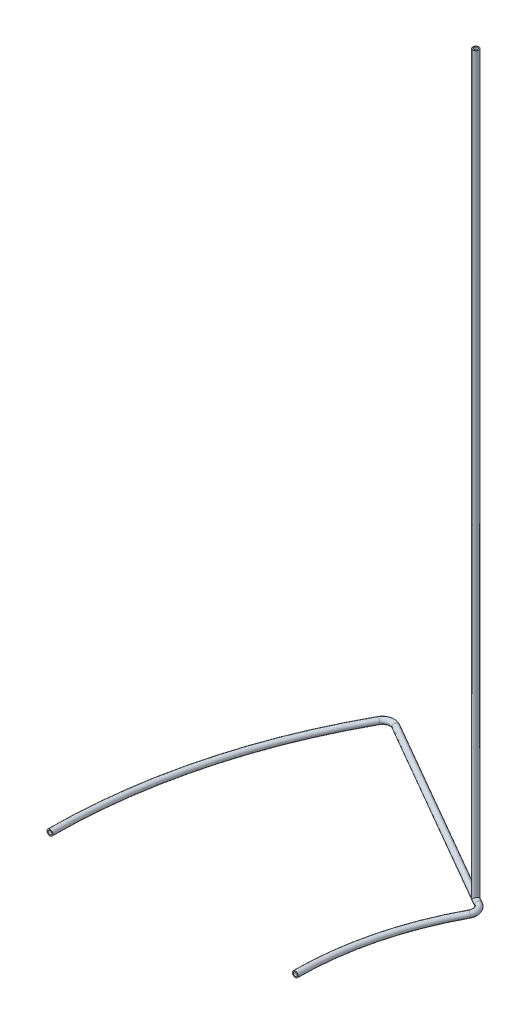
ISO-10303-21;
HEADER;
FILE_DESCRIPTION(('STEP AP214'),'2;1');
FILE_NAME('part.step','',(''),(''),'','','');
FILE_SCHEMA(('AUTOMOTIVE_DESIGN { 1 0 10303 214 1 1 1 1 }'));
ENDSEC;
DATA;
#1=APPLICATION_CONTEXT('core data for automotive mechanical design processes');
#2=APPLICATION_PROTOCOL_DEFINITION('international standard','automotive_design',2000,#1);
#3=PRODUCT_CONTEXT('',#1,'mechanical');
#4=PRODUCT('Part','Part','',(#3));
#5=PRODUCT_RELATED_PRODUCT_CATEGORY('part','',(#4));
#6=PRODUCT_DEFINITION_FORMATION('','',#4);
#7=PRODUCT_DEFINITION_CONTEXT('part definition',#1,'design');
#8=PRODUCT_DEFINITION('design','',#6,#7);
#9=PRODUCT_DEFINITION_SHAPE('','',#8);
#10=(LENGTH_UNIT() NAMED_UNIT(*) SI_UNIT(.MILLI.,.METRE.));
#11=(NAMED_UNIT(*) PLANE_ANGLE_UNIT() SI_UNIT($,.RADIAN.));
#12=(NAMED_UNIT(*) SI_UNIT($,.STERADIAN.) SOLID_ANGLE_UNIT());
#13=UNCERTAINTY_MEASURE_WITH_UNIT(LENGTH_MEASURE(1.E-05),#10,'distance_accuracy_value','');
#14=(GEOMETRIC_REPRESENTATION_CONTEXT(3) GLOBAL_UNCERTAINTY_ASSIGNED_CONTEXT((#13)) GLOBAL_UNIT_ASSIGNED_CONTEXT((#10,
#11,#12)) REPRESENTATION_CONTEXT('',''));
#15=CARTESIAN_POINT('',(0.,0.,0.));
#16=DIRECTION('',(0.,0.,1.));
#17=DIRECTION('',(1.,0.,0.));
#18=AXIS2_PLACEMENT_3D('',#15,#16,#17);
#19=CARTESIAN_POINT('',(-600.,0.,-2.98554080839911E-13));
#20=DIRECTION('',(0.,0.,-1.));
#21=DIRECTION('',(-1.,0.,0.));
#22=AXIS2_PLACEMENT_3D('',#19,#20,#21);
#23=PLANE('',#22);
#24=CARTESIAN_POINT('',(-600.,0.,0.));
#25=DIRECTION('',(0.,0.,-1.));
#26=DIRECTION('',(-1.,0.,0.));
#27=AXIS2_PLACEMENT_3D('',#24,#25,#26);
#28=CIRCLE('',#27,4.0000000000001);
#29=CARTESIAN_POINT('',(-604.,0.,0.));
#30=VERTEX_POINT('',#29);
#31=EDGE_CURVE('E93',#30,#30,#28,.T.);
#32=ORIENTED_EDGE('',*,*,#31,.T.);
#33=EDGE_LOOP('',(#32));
#34=FACE_BOUND('',#33,.T.);
#35=CARTESIAN_POINT('',(-600.,0.,-2.98554080839911E-13));
#36=DIRECTION('',(0.,0.,-1.));
#37=DIRECTION('',(-1.,0.,0.));
#38=AXIS2_PLACEMENT_3D('',#35,#36,#37);
#39=CIRCLE('',#38,6.0000000000001);
#40=CARTESIAN_POINT('',(-606.,0.,-3.01539621648311E-13));
#41=VERTEX_POINT('',#40);
#42=EDGE_CURVE('E105',#41,#41,#39,.T.);
#43=ORIENTED_EDGE('',*,*,#42,.F.);
#44=EDGE_LOOP('',(#43));
#45=FACE_BOUND('',#44,.T.);
#46=ADVANCED_FACE('F44',(#34,#45),#23,.F.);
#47=CARTESIAN_POINT('',(-1100.,0.,0.));
#48=DIRECTION('',(0.,0.,1.));
#49=DIRECTION('',(1.,0.,0.));
#50=AXIS2_PLACEMENT_3D('',#47,#48,#49);
#51=PLANE('',#50);
#52=CARTESIAN_POINT('',(-1100.,0.,0.));
#53=DIRECTION('',(0.,0.,1.));
#54=DIRECTION('',(1.,0.,0.));
#55=AXIS2_PLACEMENT_3D('',#52,#53,#54);
#56=CIRCLE('',#55,4.0000000000001);
#57=CARTESIAN_POINT('',(-1104.,0.,0.));
#58=VERTEX_POINT('',#57);
#59=EDGE_CURVE('E77',#58,#58,#56,.T.);
#60=ORIENTED_EDGE('',*,*,#59,.F.);
#61=EDGE_LOOP('',(#60));
#62=FACE_BOUND('',#61,.T.);
#63=CARTESIAN_POINT('',(-1100.,0.,0.));
#64=DIRECTION('',(0.,0.,1.));
#65=DIRECTION('',(1.,0.,0.));
#66=AXIS2_PLACEMENT_3D('',#63,#64,#65);
#67=CIRCLE('',#66,6.0000000000001);
#68=CARTESIAN_POINT('',(-1106.,0.,0.));
#69=VERTEX_POINT('',#68);
#70=EDGE_CURVE('E125',#69,#69,#67,.T.);
#71=ORIENTED_EDGE('',*,*,#70,.T.);
#72=EDGE_LOOP('',(#71));
#73=FACE_BOUND('',#72,.T.);
#74=ADVANCED_FACE('F152',(#62,#73),#51,.T.);
#75=CARTESIAN_POINT('',(0.,0.,0.));
#76=DIRECTION('',(0.,-1.,0.));
#77=DIRECTION('',(0.,0.,-1.));
#78=AXIS2_PLACEMENT_3D('',#75,#76,#77);
#79=TOROIDAL_SURFACE('',#78,600.,6.0000000000001);
#80=CARTESIAN_POINT('',(-529.022239935436,0.,-283.082089955713));
#81=DIRECTION('',(0.471803483259521,0.,-0.881703733225726));
#82=DIRECTION('',(-0.881703733225726,0.,-0.471803483259521));
#83=AXIS2_PLACEMENT_3D('',#80,#81,#82);
#84=CIRCLE('',#83,6.0000000000001);
#85=CARTESIAN_POINT('',(-534.31246233479,0.,-285.91291085527));
#86=VERTEX_POINT('',#85);
#87=EDGE_CURVE('E109',#86,#86,#84,.T.);
#88=CARTESIAN_POINT('',(0.,0.,0.));
#89=DIRECTION('',(0.,-1.,0.));
#90=DIRECTION('',(0.,0.,-1.));
#91=AXIS2_PLACEMENT_3D('',#88,#89,#90);
#92=CIRCLE('',#91,606.);
#93=EDGE_CURVE('',#41,#86,#92,.T.);
#94=ORIENTED_EDGE('',*,*,#42,.T.);
#95=ORIENTED_EDGE('',*,*,#87,.F.);
#96=ORIENTED_EDGE('',*,*,#93,.T.);
#97=ORIENTED_EDGE('',*,*,#93,.F.);
#98=EDGE_LOOP('',(#94,#96,#95,#97));
#99=FACE_BOUND('',#98,.T.);
#100=ADVANCED_FACE('F168',(#99),#79,.T.);
#101=CARTESIAN_POINT('',(-546.65631459995,0.,-292.518159620903));
#102=DIRECTION('',(0.,1.,0.));
#103=DIRECTION('',(0.,0.,1.));
#104=AXIS2_PLACEMENT_3D('',#101,#102,#103);
#105=TOROIDAL_SURFACE('',#104,20.0000000000001,6.0000000000001);
#106=CARTESIAN_POINT('',(-536.656314599951,0.,-309.838667696592));
#107=DIRECTION('',(-0.866025403784438,0.,-0.500000000000001));
#108=DIRECTION('',(-0.500000000000001,0.,0.866025403784438));
#109=AXIS2_PLACEMENT_3D('',#106,#107,#108);
#110=CIRCLE('',#109,6.0000000000001);
#111=CARTESIAN_POINT('',(-539.656314599951,0.,-304.642515273885));
#112=VERTEX_POINT('',#111);
#113=EDGE_CURVE('E113',#112,#112,#110,.T.);
#114=ORIENTED_EDGE('',*,*,#113,.F.);
#115=EDGE_LOOP('',(#114));
#116=FACE_BOUND('',#115,.T.);
#117=ORIENTED_EDGE('',*,*,#87,.T.);
#118=EDGE_LOOP('',(#117));
#119=FACE_BOUND('',#118,.T.);
#120=ADVANCED_FACE('F173',(#116,#119),#105,.T.);
#121=CARTESIAN_POINT('',(-536.656314599951,0.,-309.838667696592));
#122=DIRECTION('',(-0.86602540378444,0.,-0.499999999999997));
#123=DIRECTION('',(-0.499999999999997,0.,0.86602540378444));
#124=AXIS2_PLACEMENT_3D('',#121,#122,#123);
#125=CYLINDRICAL_SURFACE('',#124,6.0000000000001);
#126=CARTESIAN_POINT('',(-549.646695656717,0.,-317.338667696592));
#127=DIRECTION('',(-0.612372435695796,0.707106781186547,-0.353553390593272));
#128=DIRECTION('',(-0.612372435695796,-0.707106781186547,-0.353553390593272));
#129=AXIS2_PLACEMENT_3D('',#126,#127,#128);
#130=ELLIPSE('',#129,8.48528137423864,6.00000000000005);
#131=CARTESIAN_POINT('',(-552.646695656717,0.,-312.142515273885));
#132=VERTEX_POINT('',#131);
#133=CARTESIAN_POINT('',(-546.646695656717,0.,-322.534820119298));
#134=VERTEX_POINT('',#133);
#135=EDGE_CURVE('E12',#132,#134,#130,.T.);
#136=ORIENTED_EDGE('',*,*,#135,.F.);
#137=CARTESIAN_POINT('',(-549.646695656717,0.,-317.338667696592));
#138=DIRECTION('',(-0.612372435695796,-0.707106781186547,-0.353553390593272));
#139=DIRECTION('',(-0.612372435695796,0.707106781186547,-0.353553390593272));
#140=AXIS2_PLACEMENT_3D('',#137,#138,#139);
#141=ELLIPSE('',#140,8.48528137423864,6.00000000000005);
#142=EDGE_CURVE('E52',#134,#132,#141,.F.);
#143=ORIENTED_EDGE('',*,*,#142,.F.);
#144=EDGE_LOOP('',(#136,#143));
#145=FACE_BOUND('',#144,.T.);
#146=CARTESIAN_POINT('',(-935.147047260485,0.,-539.907399467721));
#147=DIRECTION('',(-0.86602540378444,0.,-0.499999999999997));
#148=DIRECTION('',(-0.499999999999997,0.,0.86602540378444));
#149=AXIS2_PLACEMENT_3D('',#146,#147,#148);
#150=CIRCLE('',#149,6.0000000000001);
#151=CARTESIAN_POINT('',(-932.147047260485,0.,-545.103551890428));
#152=VERTEX_POINT('',#151);
#153=EDGE_CURVE('E117',#152,#152,#150,.T.);
#154=ORIENTED_EDGE('',*,*,#153,.F.);
#155=EDGE_LOOP('',(#154));
#156=FACE_BOUND('',#155,.T.);
#157=ORIENTED_EDGE('',*,*,#113,.T.);
#158=EDGE_LOOP('',(#157));
#159=FACE_BOUND('',#158,.T.);
#160=ADVANCED_FACE('F161',(#145,#156,#159),#125,.T.);
#161=CARTESIAN_POINT('',(-945.147047260484,0.,-522.586891392032));
#162=DIRECTION('',(0.,1.,0.));
#163=DIRECTION('',(0.,0.,1.));
#164=AXIS2_PLACEMENT_3D('',#161,#162,#163);
#165=TOROIDAL_SURFACE('',#164,20.,6.0000000000001);
#166=CARTESIAN_POINT('',(-962.649770357904,0.,-532.264426417806));
#167=DIRECTION('',(-0.483876751288914,0.,0.875136154870821));
#168=DIRECTION('',(0.875136154870821,0.,0.483876751288915));
#169=AXIS2_PLACEMENT_3D('',#166,#167,#168);
#170=CIRCLE('',#169,6.0000000000001);
#171=CARTESIAN_POINT('',(-967.900587287129,0.,-535.167686925538));
#172=VERTEX_POINT('',#171);
#173=EDGE_CURVE('E121',#172,#172,#170,.T.);
#174=CARTESIAN_POINT('',(-945.147047260484,0.,-522.586891392032));
#175=DIRECTION('',(0.,1.,0.));
#176=DIRECTION('',(0.,0.,1.));
#177=AXIS2_PLACEMENT_3D('',#174,#175,#176);
#178=CIRCLE('',#177,26.0000000000001);
#179=EDGE_CURVE('',#152,#172,#178,.T.);
#180=ORIENTED_EDGE('',*,*,#153,.T.);
#181=ORIENTED_EDGE('',*,*,#173,.F.);
#182=ORIENTED_EDGE('',*,*,#179,.T.);
#183=ORIENTED_EDGE('',*,*,#179,.F.);
#184=EDGE_LOOP('',(#180,#182,#181,#183));
#185=FACE_BOUND('',#184,.T.);
#186=ADVANCED_FACE('F155',(#185),#165,.T.);
#187=CARTESIAN_POINT('',(0.,0.,0.));
#188=DIRECTION('',(0.,1.,0.));
#189=DIRECTION('',(0.,0.,1.));
#190=AXIS2_PLACEMENT_3D('',#187,#188,#189);
#191=TOROIDAL_SURFACE('',#190,1100.,6.0000000000001);
#192=CARTESIAN_POINT('',(0.,0.,0.));
#193=DIRECTION('',(0.,1.,0.));
#194=DIRECTION('',(0.,0.,1.));
#195=AXIS2_PLACEMENT_3D('',#192,#193,#194);
#196=CIRCLE('',#195,1106.);
#197=EDGE_CURVE('',#172,#69,#196,.T.);
#198=ORIENTED_EDGE('',*,*,#173,.T.);
#199=ORIENTED_EDGE('',*,*,#70,.F.);
#200=ORIENTED_EDGE('',*,*,#197,.T.);
#201=ORIENTED_EDGE('',*,*,#197,.F.);
#202=EDGE_LOOP('',(#198,#200,#199,#201));
#203=FACE_BOUND('',#202,.T.);
#204=ADVANCED_FACE('F145',(#203),#191,.T.);
#205=CARTESIAN_POINT('',(-549.646695656717,1500.,-317.338667696592));
#206=DIRECTION('',(0.,1.,0.));
#207=DIRECTION('',(0.,0.,1.));
#208=AXIS2_PLACEMENT_3D('',#205,#206,#207);
#209=PLANE('',#208);
#210=CARTESIAN_POINT('',(-549.646695656717,1500.,-317.338667696592));
#211=DIRECTION('',(0.,1.,0.));
#212=DIRECTION('',(0.,0.,1.));
#213=AXIS2_PLACEMENT_3D('',#210,#211,#212);
#214=CIRCLE('',#213,4.00000000000001);
#215=CARTESIAN_POINT('',(-549.646695656717,1500.,-313.338667696592));
#216=VERTEX_POINT('',#215);
#217=EDGE_CURVE('E97',#216,#216,#214,.T.);
#218=ORIENTED_EDGE('',*,*,#217,.F.);
#219=EDGE_LOOP('',(#218));
#220=FACE_BOUND('',#219,.T.);
#221=CARTESIAN_POINT('',(-549.646695656717,1500.,-317.338667696592));
#222=DIRECTION('',(0.,1.,0.));
#223=DIRECTION('',(0.,0.,1.));
#224=AXIS2_PLACEMENT_3D('',#221,#222,#223);
#225=CIRCLE('',#224,6.00000000000001);
#226=CARTESIAN_POINT('',(-549.646695656717,1500.,-311.338667696592));
#227=VERTEX_POINT('',#226);
#228=EDGE_CURVE('E72',#227,#227,#225,.T.);
#229=ORIENTED_EDGE('',*,*,#228,.T.);
#230=EDGE_LOOP('',(#229));
#231=FACE_BOUND('',#230,.T.);
#232=ADVANCED_FACE('F133',(#220,#231),#209,.T.);
#233=CARTESIAN_POINT('',(-549.646695656717,0.,-317.338667696592));
#234=DIRECTION('',(0.,1.,0.));
#235=DIRECTION('',(0.,0.,1.));
#236=AXIS2_PLACEMENT_3D('',#233,#234,#235);
#237=CYLINDRICAL_SURFACE('',#236,6.00000000000001);
#238=ORIENTED_EDGE('',*,*,#228,.F.);
#239=EDGE_LOOP('',(#238));
#240=FACE_BOUND('',#239,.T.);
#241=ORIENTED_EDGE('',*,*,#142,.T.);
#242=ORIENTED_EDGE('',*,*,#135,.T.);
#243=EDGE_LOOP('',(#241,#242));
#244=FACE_BOUND('',#243,.T.);
#245=ADVANCED_FACE('F130',(#240,#244),#237,.T.);
#246=CARTESIAN_POINT('',(0.,0.,0.));
#247=DIRECTION('',(0.,-1.,0.));
#248=DIRECTION('',(0.,0.,-1.));
#249=AXIS2_PLACEMENT_3D('',#246,#247,#248);
#250=TOROIDAL_SURFACE('',#249,600.,4.0000000000001);
#251=CARTESIAN_POINT('',(-529.022239935436,0.,-283.082089955713));
#252=DIRECTION('',(-0.471803483259513,0.,0.881703733225731));
#253=DIRECTION('',(0.881703733225731,0.,0.471803483259513));
#254=AXIS2_PLACEMENT_3D('',#251,#252,#253);
#255=CIRCLE('',#254,4.0000000000001);
#256=CARTESIAN_POINT('',(-532.549054868339,0.,-284.969303888751));
#257=VERTEX_POINT('',#256);
#258=EDGE_CURVE('E96',#257,#257,#255,.F.);
#259=CARTESIAN_POINT('',(0.,0.,0.));
#260=DIRECTION('',(0.,-1.,0.));
#261=DIRECTION('',(0.,0.,-1.));
#262=AXIS2_PLACEMENT_3D('',#259,#260,#261);
#263=CIRCLE('',#262,604.);
#264=EDGE_CURVE('',#30,#257,#263,.T.);
#265=ORIENTED_EDGE('',*,*,#31,.F.);
#266=ORIENTED_EDGE('',*,*,#258,.T.);
#267=ORIENTED_EDGE('',*,*,#264,.T.);
#268=ORIENTED_EDGE('',*,*,#264,.F.);
#269=EDGE_LOOP('',(#265,#267,#266,#268));
#270=FACE_BOUND('',#269,.T.);
#271=ADVANCED_FACE('F132',(#270),#250,.F.);
#272=CARTESIAN_POINT('',(-546.65631459995,0.,-292.518159620903));
#273=DIRECTION('',(0.,1.,0.));
#274=DIRECTION('',(0.,0.,1.));
#275=AXIS2_PLACEMENT_3D('',#272,#273,#274);
#276=TOROIDAL_SURFACE('',#275,20.0000000000001,4.0000000000001);
#277=CARTESIAN_POINT('',(-536.656314599951,0.,-309.838667696592));
#278=DIRECTION('',(-0.86602540378444,0.,-0.499999999999997));
#279=DIRECTION('',(-0.499999999999997,0.,0.86602540378444));
#280=AXIS2_PLACEMENT_3D('',#277,#278,#279);
#281=CIRCLE('',#280,4.0000000000001);
#282=CARTESIAN_POINT('',(-538.656314599951,0.,-306.374566081454));
#283=VERTEX_POINT('',#282);
#284=EDGE_CURVE('E89',#283,#283,#281,.T.);
#285=ORIENTED_EDGE('',*,*,#284,.T.);
#286=EDGE_LOOP('',(#285));
#287=FACE_BOUND('',#286,.T.);
#288=ORIENTED_EDGE('',*,*,#258,.F.);
#289=EDGE_LOOP('',(#288));
#290=FACE_BOUND('',#289,.T.);
#291=ADVANCED_FACE('F141',(#287,#290),#276,.F.);
#292=CARTESIAN_POINT('',(-536.656314599951,0.,-309.838667696592));
#293=DIRECTION('',(-0.86602540378444,0.,-0.499999999999997));
#294=DIRECTION('',(-0.499999999999997,0.,0.86602540378444));
#295=AXIS2_PLACEMENT_3D('',#292,#293,#294);
#296=CYLINDRICAL_SURFACE('',#295,4.0000000000001);
#297=CARTESIAN_POINT('',(-549.646695656717,0.,-317.338667696592));
#298=DIRECTION('',(-0.612372435695796,0.707106781186547,-0.353553390593272));
#299=DIRECTION('',(-0.612372435695796,-0.707106781186547,-0.353553390593272));
#300=AXIS2_PLACEMENT_3D('',#297,#298,#299);
#301=ELLIPSE('',#300,5.65685424949245,4.00000000000005);
#302=CARTESIAN_POINT('',(-551.646695656717,0.,-313.874566081454));
#303=VERTEX_POINT('',#302);
#304=CARTESIAN_POINT('',(-547.646695656717,0.,-320.802769311729));
#305=VERTEX_POINT('',#304);
#306=EDGE_CURVE('E66',#303,#305,#301,.T.);
#307=ORIENTED_EDGE('',*,*,#306,.T.);
#308=CARTESIAN_POINT('',(-549.646695656717,0.,-317.338667696592));
#309=DIRECTION('',(-0.612372435695796,-0.707106781186547,-0.353553390593272));
#310=DIRECTION('',(-0.612372435695796,0.707106781186547,-0.353553390593272));
#311=AXIS2_PLACEMENT_3D('',#308,#309,#310);
#312=ELLIPSE('',#311,5.65685424949245,4.00000000000005);
#313=EDGE_CURVE('E69',#305,#303,#312,.F.);
#314=ORIENTED_EDGE('',*,*,#313,.T.);
#315=EDGE_LOOP('',(#307,#314));
#316=FACE_BOUND('',#315,.T.);
#317=CARTESIAN_POINT('',(-935.147047260485,0.,-539.907399467721));
#318=DIRECTION('',(0.866025403784446,0.,0.499999999999987));
#319=DIRECTION('',(0.499999999999987,0.,-0.866025403784446));
#320=AXIS2_PLACEMENT_3D('',#317,#318,#319);
#321=CIRCLE('',#320,4.0000000000001);
#322=CARTESIAN_POINT('',(-933.147047260485,0.,-543.371501082859));
#323=VERTEX_POINT('',#322);
#324=EDGE_CURVE('E85',#323,#323,#321,.F.);
#325=ORIENTED_EDGE('',*,*,#324,.T.);
#326=EDGE_LOOP('',(#325));
#327=FACE_BOUND('',#326,.T.);
#328=ORIENTED_EDGE('',*,*,#284,.F.);
#329=EDGE_LOOP('',(#328));
#330=FACE_BOUND('',#329,.T.);
#331=ADVANCED_FACE('F74',(#316,#327,#330),#296,.F.);
#332=CARTESIAN_POINT('',(-945.147047260484,0.,-522.586891392032));
#333=DIRECTION('',(0.,1.,0.));
#334=DIRECTION('',(0.,0.,1.));
#335=AXIS2_PLACEMENT_3D('',#332,#333,#334);
#336=TOROIDAL_SURFACE('',#335,20.,4.0000000000001);
#337=CARTESIAN_POINT('',(-962.649770357903,0.,-532.264426417807));
#338=DIRECTION('',(0.483876751288915,0.,-0.875136154870821));
#339=DIRECTION('',(-0.875136154870821,0.,-0.483876751288915));
#340=AXIS2_PLACEMENT_3D('',#337,#338,#339);
#341=CIRCLE('',#340,4.0000000000001);
#342=CARTESIAN_POINT('',(-966.150314977387,0.,-534.199933422962));
#343=VERTEX_POINT('',#342);
#344=EDGE_CURVE('E81',#343,#343,#341,.F.);
#345=CARTESIAN_POINT('',(-945.147047260484,0.,-522.586891392032));
#346=DIRECTION('',(0.,1.,0.));
#347=DIRECTION('',(0.,0.,1.));
#348=AXIS2_PLACEMENT_3D('',#345,#346,#347);
#349=CIRCLE('',#348,24.0000000000001);
#350=EDGE_CURVE('',#323,#343,#349,.T.);
#351=ORIENTED_EDGE('',*,*,#324,.F.);
#352=ORIENTED_EDGE('',*,*,#344,.T.);
#353=ORIENTED_EDGE('',*,*,#350,.T.);
#354=ORIENTED_EDGE('',*,*,#350,.F.);
#355=EDGE_LOOP('',(#351,#353,#352,#354));
#356=FACE_BOUND('',#355,.T.);
#357=ADVANCED_FACE('F181',(#356),#336,.F.);
#358=CARTESIAN_POINT('',(0.,0.,0.));
#359=DIRECTION('',(0.,1.,0.));
#360=DIRECTION('',(0.,0.,1.));
#361=AXIS2_PLACEMENT_3D('',#358,#359,#360);
#362=TOROIDAL_SURFACE('',#361,1100.,4.0000000000001);
#363=CARTESIAN_POINT('',(0.,0.,0.));
#364=DIRECTION('',(0.,1.,0.));
#365=DIRECTION('',(0.,0.,1.));
#366=AXIS2_PLACEMENT_3D('',#363,#364,#365);
#367=CIRCLE('',#366,1104.);
#368=EDGE_CURVE('',#343,#58,#367,.T.);
#369=ORIENTED_EDGE('',*,*,#344,.F.);
#370=ORIENTED_EDGE('',*,*,#59,.T.);
#371=ORIENTED_EDGE('',*,*,#368,.T.);
#372=ORIENTED_EDGE('',*,*,#368,.F.);
#373=EDGE_LOOP('',(#369,#371,#370,#372));
#374=FACE_BOUND('',#373,.T.);
#375=ADVANCED_FACE('F148',(#374),#362,.F.);
#376=CARTESIAN_POINT('',(-549.646695656717,0.,-317.338667696592));
#377=DIRECTION('',(0.,1.,0.));
#378=DIRECTION('',(0.,0.,1.));
#379=AXIS2_PLACEMENT_3D('',#376,#377,#378);
#380=CYLINDRICAL_SURFACE('',#379,4.00000000000001);
#381=ORIENTED_EDGE('',*,*,#217,.T.);
#382=EDGE_LOOP('',(#381));
#383=FACE_BOUND('',#382,.T.);
#384=ORIENTED_EDGE('',*,*,#313,.F.);
#385=ORIENTED_EDGE('',*,*,#306,.F.);
#386=EDGE_LOOP('',(#384,#385));
#387=FACE_BOUND('',#386,.T.);
#388=ADVANCED_FACE('F68',(#383,#387),#380,.F.);
#389=CLOSED_SHELL('',(#46,#74,#100,#120,#160,#186,#204,#232,#245,#271,#291,#331,#357,#375,#388));
#390=MANIFOLD_SOLID_BREP('B2',#389);
#391=ADVANCED_BREP_SHAPE_REPRESENTATION('',(#18,#390),#14);
#392=SHAPE_DEFINITION_REPRESENTATION(#9,#391);
ENDSEC;
END-ISO-10303-21;
